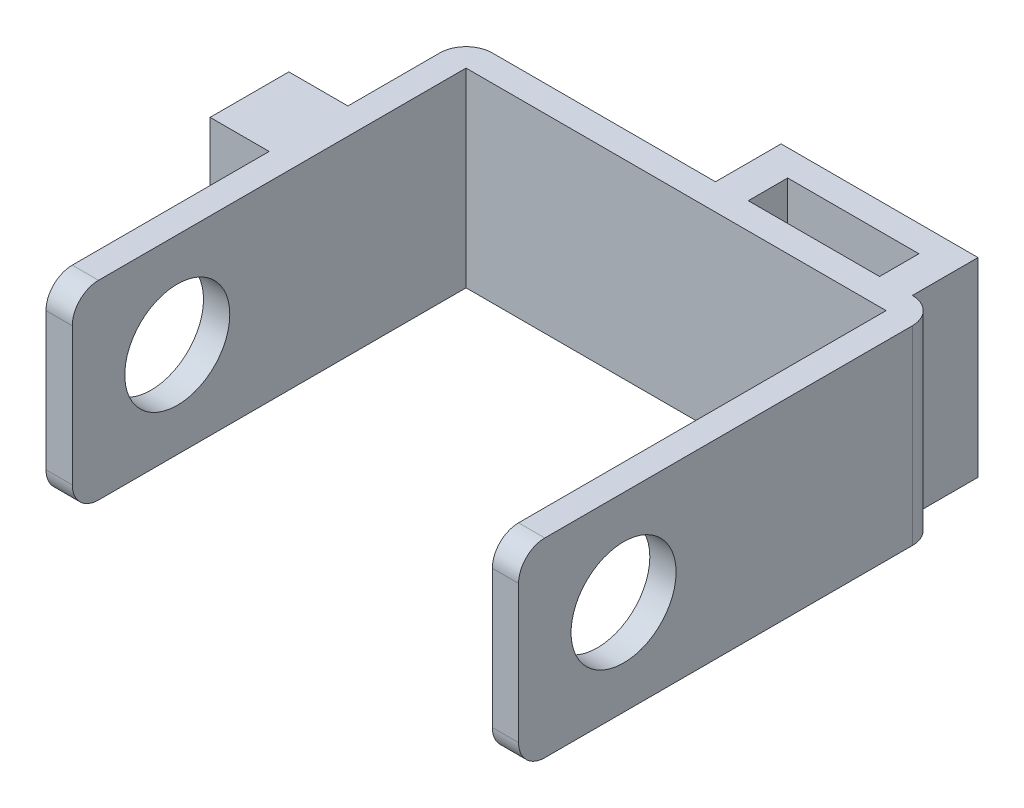
ISO-10303-21;
HEADER;
FILE_DESCRIPTION(('STEP AP214'),'2;1');
FILE_NAME('part.step','',(''),(''),'','','');
FILE_SCHEMA(('AUTOMOTIVE_DESIGN { 1 0 10303 214 1 1 1 1 }'));
ENDSEC;
DATA;
#1=APPLICATION_CONTEXT('core data for automotive mechanical design processes');
#2=APPLICATION_PROTOCOL_DEFINITION('international standard','automotive_design',2000,#1);
#3=PRODUCT_CONTEXT('',#1,'mechanical');
#4=PRODUCT('Part','Part','',(#3));
#5=PRODUCT_RELATED_PRODUCT_CATEGORY('part','',(#4));
#6=PRODUCT_DEFINITION_FORMATION('','',#4);
#7=PRODUCT_DEFINITION_CONTEXT('part definition',#1,'design');
#8=PRODUCT_DEFINITION('design','',#6,#7);
#9=PRODUCT_DEFINITION_SHAPE('','',#8);
#10=(LENGTH_UNIT() NAMED_UNIT(*) SI_UNIT(.MILLI.,.METRE.));
#11=(NAMED_UNIT(*) PLANE_ANGLE_UNIT() SI_UNIT($,.RADIAN.));
#12=(NAMED_UNIT(*) SI_UNIT($,.STERADIAN.) SOLID_ANGLE_UNIT());
#13=UNCERTAINTY_MEASURE_WITH_UNIT(LENGTH_MEASURE(1.E-05),#10,'distance_accuracy_value','');
#14=(GEOMETRIC_REPRESENTATION_CONTEXT(3) GLOBAL_UNCERTAINTY_ASSIGNED_CONTEXT((#13)) GLOBAL_UNIT_ASSIGNED_CONTEXT((#10,
#11,#12)) REPRESENTATION_CONTEXT('',''));
#15=CARTESIAN_POINT('',(0.,0.,0.));
#16=DIRECTION('',(0.,0.,1.));
#17=DIRECTION('',(1.,0.,0.));
#18=AXIS2_PLACEMENT_3D('',#15,#16,#17);
#19=CARTESIAN_POINT('',(-2.,14.5,0.));
#20=DIRECTION('',(-1.,0.,0.));
#21=DIRECTION('',(0.,0.,1.));
#22=AXIS2_PLACEMENT_3D('',#19,#20,#21);
#23=PLANE('',#22);
#24=CARTESIAN_POINT('',(-2.,7.25,-8.));
#25=DIRECTION('',(-1.,0.,0.));
#26=DIRECTION('',(0.,0.,1.));
#27=AXIS2_PLACEMENT_3D('',#24,#25,#26);
#28=CIRCLE('',#27,4.);
#29=CARTESIAN_POINT('',(-2.,7.25,-12.));
#30=VERTEX_POINT('',#29);
#31=EDGE_CURVE('E282',#30,#30,#28,.T.);
#32=ORIENTED_EDGE('',*,*,#31,.F.);
#33=EDGE_LOOP('',(#32));
#34=FACE_BOUND('',#33,.T.);
#35=DIRECTION('',(0.,0.,-1.));
#36=VECTOR('',#35,1.);
#37=CARTESIAN_POINT('',(-2.,14.5,0.));
#38=LINE('',#37,#36);
#39=CARTESIAN_POINT('',(-2.,14.5,-2.));
#40=VERTEX_POINT('',#39);
#41=CARTESIAN_POINT('',(-2.,14.5,-17.));
#42=VERTEX_POINT('',#41);
#43=EDGE_CURVE('E322',#40,#42,#38,.T.);
#44=ORIENTED_EDGE('',*,*,#43,.T.);
#45=DIRECTION('',(0.,1.,0.));
#46=VECTOR('',#45,1.);
#47=CARTESIAN_POINT('',(-2.,14.5,-17.));
#48=LINE('',#47,#46);
#49=CARTESIAN_POINT('',(-2.,10.25,-17.));
#50=VERTEX_POINT('',#49);
#51=EDGE_CURVE('E268',#50,#42,#48,.T.);
#52=ORIENTED_EDGE('',*,*,#51,.F.);
#53=DIRECTION('',(0.,0.,1.));
#54=VECTOR('',#53,1.);
#55=CARTESIAN_POINT('',(-2.,10.25,-37.));
#56=LINE('',#55,#54);
#57=CARTESIAN_POINT('',(-2.,10.25,-23.));
#58=VERTEX_POINT('',#57);
#59=EDGE_CURVE('E245',#58,#50,#56,.T.);
#60=ORIENTED_EDGE('',*,*,#59,.F.);
#61=DIRECTION('',(0.,-1.,0.));
#62=VECTOR('',#61,1.);
#63=CARTESIAN_POINT('',(-2.,14.5,-23.));
#64=LINE('',#63,#62);
#65=CARTESIAN_POINT('',(-2.,14.5,-23.));
#66=VERTEX_POINT('',#65);
#67=EDGE_CURVE('E265',#66,#58,#64,.T.);
#68=ORIENTED_EDGE('',*,*,#67,.F.);
#69=CARTESIAN_POINT('',(-2.,14.5,-30.));
#70=VERTEX_POINT('',#69);
#71=EDGE_CURVE('E326',#66,#70,#38,.T.);
#72=ORIENTED_EDGE('',*,*,#71,.T.);
#73=DIRECTION('',(0.,-1.,0.));
#74=VECTOR('',#73,1.);
#75=CARTESIAN_POINT('',(-2.,14.5,-30.));
#76=LINE('',#75,#74);
#77=CARTESIAN_POINT('',(-2.,0.,-30.));
#78=VERTEX_POINT('',#77);
#79=EDGE_CURVE('E406',#70,#78,#76,.T.);
#80=ORIENTED_EDGE('',*,*,#79,.T.);
#81=DIRECTION('',(0.,0.,-1.));
#82=VECTOR('',#81,1.);
#83=CARTESIAN_POINT('',(-2.,0.,0.));
#84=LINE('',#83,#82);
#85=CARTESIAN_POINT('',(-2.,0.,-23.));
#86=VERTEX_POINT('',#85);
#87=EDGE_CURVE('E315',#86,#78,#84,.T.);
#88=ORIENTED_EDGE('',*,*,#87,.F.);
#89=CARTESIAN_POINT('',(-2.,4.25,-23.));
#90=VERTEX_POINT('',#89);
#91=EDGE_CURVE('E254',#90,#86,#64,.T.);
#92=ORIENTED_EDGE('',*,*,#91,.F.);
#93=DIRECTION('',(0.,0.,1.));
#94=VECTOR('',#93,1.);
#95=CARTESIAN_POINT('',(-2.,4.25,-37.));
#96=LINE('',#95,#94);
#97=CARTESIAN_POINT('',(-2.,4.25,-17.));
#98=VERTEX_POINT('',#97);
#99=EDGE_CURVE('E230',#90,#98,#96,.T.);
#100=ORIENTED_EDGE('',*,*,#99,.T.);
#101=CARTESIAN_POINT('',(-2.,0.,-17.));
#102=VERTEX_POINT('',#101);
#103=EDGE_CURVE('E240',#102,#98,#48,.T.);
#104=ORIENTED_EDGE('',*,*,#103,.F.);
#105=CARTESIAN_POINT('',(-2.,0.,-2.));
#106=VERTEX_POINT('',#105);
#107=EDGE_CURVE('E347',#106,#102,#84,.T.);
#108=ORIENTED_EDGE('',*,*,#107,.F.);
#109=CARTESIAN_POINT('',(-2.,2.,-2.));
#110=DIRECTION('',(-1.,0.,0.));
#111=DIRECTION('',(0.,0.,1.));
#112=AXIS2_PLACEMENT_3D('',#109,#110,#111);
#113=CIRCLE('',#112,2.);
#114=CARTESIAN_POINT('',(-2.,2.,0.));
#115=VERTEX_POINT('',#114);
#116=EDGE_CURVE('E445',#106,#115,#113,.T.);
#117=ORIENTED_EDGE('',*,*,#116,.T.);
#118=DIRECTION('',(0.,-1.,0.));
#119=VECTOR('',#118,1.);
#120=CARTESIAN_POINT('',(-2.,14.5,0.));
#121=LINE('',#120,#119);
#122=CARTESIAN_POINT('',(-2.,12.5,0.));
#123=VERTEX_POINT('',#122);
#124=EDGE_CURVE('E346',#123,#115,#121,.T.);
#125=ORIENTED_EDGE('',*,*,#124,.F.);
#126=CARTESIAN_POINT('',(-2.,12.5,-2.));
#127=DIRECTION('',(-1.,0.,0.));
#128=DIRECTION('',(0.,0.,1.));
#129=AXIS2_PLACEMENT_3D('',#126,#127,#128);
#130=CIRCLE('',#129,2.);
#131=EDGE_CURVE('E418',#123,#40,#130,.T.);
#132=ORIENTED_EDGE('',*,*,#131,.T.);
#133=EDGE_LOOP('',(#44,#52,#60,#68,#72,#80,#88,#92,#100,#104,#108,#117,#125,#132));
#134=FACE_BOUND('',#133,.T.);
#135=ADVANCED_FACE('F33',(#34,#134),#23,.T.);
#136=CARTESIAN_POINT('',(0.,14.5,0.));
#137=DIRECTION('',(0.,0.,1.));
#138=DIRECTION('',(1.,0.,0.));
#139=AXIS2_PLACEMENT_3D('',#136,#137,#138);
#140=PLANE('',#139);
#141=ORIENTED_EDGE('',*,*,#124,.T.);
#142=DIRECTION('',(-1.,0.,0.));
#143=VECTOR('',#142,1.);
#144=CARTESIAN_POINT('',(0.,2.,0.));
#145=LINE('',#144,#143);
#146=CARTESIAN_POINT('',(0.,2.,0.));
#147=VERTEX_POINT('',#146);
#148=EDGE_CURVE('E41',#115,#147,#145,.F.);
#149=ORIENTED_EDGE('',*,*,#148,.T.);
#150=DIRECTION('',(0.,-1.,0.));
#151=VECTOR('',#150,1.);
#152=CARTESIAN_POINT('',(0.,14.5,0.));
#153=LINE('',#152,#151);
#154=CARTESIAN_POINT('',(0.,12.5,0.));
#155=VERTEX_POINT('',#154);
#156=EDGE_CURVE('E371',#155,#147,#153,.T.);
#157=ORIENTED_EDGE('',*,*,#156,.F.);
#158=DIRECTION('',(-1.,0.,0.));
#159=VECTOR('',#158,1.);
#160=CARTESIAN_POINT('',(-2.,12.5,0.));
#161=LINE('',#160,#159);
#162=EDGE_CURVE('E415',#155,#123,#161,.T.);
#163=ORIENTED_EDGE('',*,*,#162,.T.);
#164=EDGE_LOOP('',(#141,#149,#157,#163));
#165=FACE_BOUND('',#164,.T.);
#166=ADVANCED_FACE('F449',(#165),#140,.T.);
#167=CARTESIAN_POINT('',(0.,14.5,0.));
#168=DIRECTION('',(-1.,0.,0.));
#169=DIRECTION('',(0.,0.,1.));
#170=AXIS2_PLACEMENT_3D('',#167,#168,#169);
#171=PLANE('',#170);
#172=CARTESIAN_POINT('',(0.,7.25,-8.));
#173=DIRECTION('',(-1.,0.,0.));
#174=DIRECTION('',(0.,0.,1.));
#175=AXIS2_PLACEMENT_3D('',#172,#173,#174);
#176=CIRCLE('',#175,4.);
#177=CARTESIAN_POINT('',(0.,7.25,-12.));
#178=VERTEX_POINT('',#177);
#179=EDGE_CURVE('E286',#178,#178,#176,.T.);
#180=ORIENTED_EDGE('',*,*,#179,.T.);
#181=EDGE_LOOP('',(#180));
#182=FACE_BOUND('',#181,.T.);
#183=ORIENTED_EDGE('',*,*,#156,.T.);
#184=CARTESIAN_POINT('',(0.,2.,-2.));
#185=DIRECTION('',(-1.,0.,0.));
#186=DIRECTION('',(0.,0.,1.));
#187=AXIS2_PLACEMENT_3D('',#184,#185,#186);
#188=CIRCLE('',#187,2.);
#189=CARTESIAN_POINT('',(0.,0.,-2.));
#190=VERTEX_POINT('',#189);
#191=EDGE_CURVE('E11',#147,#190,#188,.F.);
#192=ORIENTED_EDGE('',*,*,#191,.T.);
#193=DIRECTION('',(0.,0.,-1.));
#194=VECTOR('',#193,1.);
#195=CARTESIAN_POINT('',(0.,0.,0.));
#196=LINE('',#195,#194);
#197=CARTESIAN_POINT('',(0.,0.,-30.));
#198=VERTEX_POINT('',#197);
#199=EDGE_CURVE('E369',#190,#198,#196,.T.);
#200=ORIENTED_EDGE('',*,*,#199,.T.);
#201=DIRECTION('',(0.,-1.,0.));
#202=VECTOR('',#201,1.);
#203=CARTESIAN_POINT('',(0.,14.5,-30.));
#204=LINE('',#203,#202);
#205=CARTESIAN_POINT('',(0.,14.5,-30.));
#206=VERTEX_POINT('',#205);
#207=EDGE_CURVE('E375',#206,#198,#204,.T.);
#208=ORIENTED_EDGE('',*,*,#207,.F.);
#209=DIRECTION('',(0.,0.,-1.));
#210=VECTOR('',#209,1.);
#211=CARTESIAN_POINT('',(0.,14.5,0.));
#212=LINE('',#211,#210);
#213=CARTESIAN_POINT('',(0.,14.5,-2.));
#214=VERTEX_POINT('',#213);
#215=EDGE_CURVE('E344',#214,#206,#212,.T.);
#216=ORIENTED_EDGE('',*,*,#215,.F.);
#217=CARTESIAN_POINT('',(0.,12.5,-2.));
#218=DIRECTION('',(-1.,0.,0.));
#219=DIRECTION('',(0.,0.,1.));
#220=AXIS2_PLACEMENT_3D('',#217,#218,#219);
#221=CIRCLE('',#220,2.);
#222=EDGE_CURVE('E422',#214,#155,#221,.F.);
#223=ORIENTED_EDGE('',*,*,#222,.T.);
#224=EDGE_LOOP('',(#183,#192,#200,#208,#216,#223));
#225=FACE_BOUND('',#224,.T.);
#226=ADVANCED_FACE('F455',(#182,#225),#171,.F.);
#227=CARTESIAN_POINT('',(0.,14.5,-30.));
#228=DIRECTION('',(0.,0.,-1.));
#229=DIRECTION('',(-1.,0.,0.));
#230=AXIS2_PLACEMENT_3D('',#227,#228,#229);
#231=PLANE('',#230);
#232=DIRECTION('',(1.,0.,0.));
#233=VECTOR('',#232,1.);
#234=CARTESIAN_POINT('',(0.,0.,-30.));
#235=LINE('',#234,#233);
#236=CARTESIAN_POINT('',(32.,0.,-30.));
#237=VERTEX_POINT('',#236);
#238=EDGE_CURVE('E366',#198,#237,#235,.T.);
#239=ORIENTED_EDGE('',*,*,#238,.T.);
#240=DIRECTION('',(0.,-1.,0.));
#241=VECTOR('',#240,1.);
#242=CARTESIAN_POINT('',(32.,14.5,-30.));
#243=LINE('',#242,#241);
#244=CARTESIAN_POINT('',(32.,14.5,-30.));
#245=VERTEX_POINT('',#244);
#246=EDGE_CURVE('E378',#245,#237,#243,.T.);
#247=ORIENTED_EDGE('',*,*,#246,.F.);
#248=DIRECTION('',(1.,0.,0.));
#249=VECTOR('',#248,1.);
#250=CARTESIAN_POINT('',(0.,14.5,-30.));
#251=LINE('',#250,#249);
#252=EDGE_CURVE('E341',#206,#245,#251,.T.);
#253=ORIENTED_EDGE('',*,*,#252,.F.);
#254=ORIENTED_EDGE('',*,*,#207,.T.);
#255=EDGE_LOOP('',(#239,#247,#253,#254));
#256=FACE_BOUND('',#255,.T.);
#257=ADVANCED_FACE('F536',(#256),#231,.F.);
#258=CARTESIAN_POINT('',(32.,14.5,0.));
#259=DIRECTION('',(-1.,0.,0.));
#260=DIRECTION('',(0.,0.,1.));
#261=AXIS2_PLACEMENT_3D('',#258,#259,#260);
#262=PLANE('',#261);
#263=CARTESIAN_POINT('',(32.,7.25,-8.));
#264=DIRECTION('',(-1.,0.,0.));
#265=DIRECTION('',(0.,0.,1.));
#266=AXIS2_PLACEMENT_3D('',#263,#264,#265);
#267=CIRCLE('',#266,4.);
#268=CARTESIAN_POINT('',(32.,7.25,-4.));
#269=VERTEX_POINT('',#268);
#270=EDGE_CURVE('E283',#269,#269,#267,.T.);
#271=ORIENTED_EDGE('',*,*,#270,.F.);
#272=EDGE_LOOP('',(#271));
#273=FACE_BOUND('',#272,.T.);
#274=DIRECTION('',(0.,0.,-1.));
#275=VECTOR('',#274,1.);
#276=CARTESIAN_POINT('',(32.,0.,0.));
#277=LINE('',#276,#275);
#278=CARTESIAN_POINT('',(32.,0.,-2.));
#279=VERTEX_POINT('',#278);
#280=EDGE_CURVE('E364',#279,#237,#277,.T.);
#281=ORIENTED_EDGE('',*,*,#280,.F.);
#282=CARTESIAN_POINT('',(32.,2.,-2.));
#283=DIRECTION('',(-1.,0.,0.));
#284=DIRECTION('',(0.,0.,1.));
#285=AXIS2_PLACEMENT_3D('',#282,#283,#284);
#286=CIRCLE('',#285,2.);
#287=CARTESIAN_POINT('',(32.,2.,0.));
#288=VERTEX_POINT('',#287);
#289=EDGE_CURVE('E440',#279,#288,#286,.T.);
#290=ORIENTED_EDGE('',*,*,#289,.T.);
#291=DIRECTION('',(0.,-1.,0.));
#292=VECTOR('',#291,1.);
#293=CARTESIAN_POINT('',(32.,14.5,0.));
#294=LINE('',#293,#292);
#295=CARTESIAN_POINT('',(32.,12.5,0.));
#296=VERTEX_POINT('',#295);
#297=EDGE_CURVE('E381',#296,#288,#294,.T.);
#298=ORIENTED_EDGE('',*,*,#297,.F.);
#299=CARTESIAN_POINT('',(32.,12.5,-2.));
#300=DIRECTION('',(-1.,0.,0.));
#301=DIRECTION('',(0.,0.,1.));
#302=AXIS2_PLACEMENT_3D('',#299,#300,#301);
#303=CIRCLE('',#302,2.);
#304=CARTESIAN_POINT('',(32.,14.5,-2.));
#305=VERTEX_POINT('',#304);
#306=EDGE_CURVE('E431',#296,#305,#303,.T.);
#307=ORIENTED_EDGE('',*,*,#306,.T.);
#308=DIRECTION('',(0.,0.,-1.));
#309=VECTOR('',#308,1.);
#310=CARTESIAN_POINT('',(32.,14.5,0.));
#311=LINE('',#310,#309);
#312=EDGE_CURVE('E339',#305,#245,#311,.T.);
#313=ORIENTED_EDGE('',*,*,#312,.T.);
#314=ORIENTED_EDGE('',*,*,#246,.T.);
#315=EDGE_LOOP('',(#281,#290,#298,#307,#313,#314));
#316=FACE_BOUND('',#315,.T.);
#317=ADVANCED_FACE('F529',(#273,#316),#262,.T.);
#318=CARTESIAN_POINT('',(32.,14.5,0.));
#319=DIRECTION('',(0.,0.,-1.));
#320=DIRECTION('',(-1.,0.,0.));
#321=AXIS2_PLACEMENT_3D('',#318,#319,#320);
#322=PLANE('',#321);
#323=ORIENTED_EDGE('',*,*,#297,.T.);
#324=DIRECTION('',(1.,0.,0.));
#325=VECTOR('',#324,1.);
#326=CARTESIAN_POINT('',(34.,2.,0.));
#327=LINE('',#326,#325);
#328=CARTESIAN_POINT('',(34.,2.,0.));
#329=VERTEX_POINT('',#328);
#330=EDGE_CURVE('E433',#288,#329,#327,.T.);
#331=ORIENTED_EDGE('',*,*,#330,.T.);
#332=DIRECTION('',(0.,-1.,0.));
#333=VECTOR('',#332,1.);
#334=CARTESIAN_POINT('',(34.,14.5,0.));
#335=LINE('',#334,#333);
#336=CARTESIAN_POINT('',(34.,12.5,0.));
#337=VERTEX_POINT('',#336);
#338=EDGE_CURVE('E384',#337,#329,#335,.T.);
#339=ORIENTED_EDGE('',*,*,#338,.F.);
#340=DIRECTION('',(1.,0.,0.));
#341=VECTOR('',#340,1.);
#342=CARTESIAN_POINT('',(32.,12.5,0.));
#343=LINE('',#342,#341);
#344=EDGE_CURVE('E429',#337,#296,#343,.F.);
#345=ORIENTED_EDGE('',*,*,#344,.T.);
#346=EDGE_LOOP('',(#323,#331,#339,#345));
#347=FACE_BOUND('',#346,.T.);
#348=ADVANCED_FACE('F523',(#347),#322,.F.);
#349=CARTESIAN_POINT('',(34.,14.5,-32.));
#350=DIRECTION('',(1.,0.,0.));
#351=DIRECTION('',(0.,0.,-1.));
#352=AXIS2_PLACEMENT_3D('',#349,#350,#351);
#353=PLANE('',#352);
#354=CARTESIAN_POINT('',(34.,7.25,-8.));
#355=DIRECTION('',(1.,0.,0.));
#356=DIRECTION('',(0.,0.,-1.));
#357=AXIS2_PLACEMENT_3D('',#354,#355,#356);
#358=CIRCLE('',#357,4.);
#359=CARTESIAN_POINT('',(34.,7.25,-12.));
#360=VERTEX_POINT('',#359);
#361=EDGE_CURVE('E279',#360,#360,#358,.T.);
#362=ORIENTED_EDGE('',*,*,#361,.F.);
#363=EDGE_LOOP('',(#362));
#364=FACE_BOUND('',#363,.T.);
#365=ORIENTED_EDGE('',*,*,#338,.T.);
#366=CARTESIAN_POINT('',(34.,2.,-2.));
#367=DIRECTION('',(1.,0.,0.));
#368=DIRECTION('',(0.,0.,-1.));
#369=AXIS2_PLACEMENT_3D('',#366,#367,#368);
#370=CIRCLE('',#369,2.);
#371=CARTESIAN_POINT('',(34.,0.,-2.));
#372=VERTEX_POINT('',#371);
#373=EDGE_CURVE('E436',#329,#372,#370,.T.);
#374=ORIENTED_EDGE('',*,*,#373,.T.);
#375=DIRECTION('',(0.,0.,1.));
#376=VECTOR('',#375,1.);
#377=CARTESIAN_POINT('',(34.,0.,-32.));
#378=LINE('',#377,#376);
#379=CARTESIAN_POINT('',(34.,0.,-30.));
#380=VERTEX_POINT('',#379);
#381=EDGE_CURVE('E361',#380,#372,#378,.T.);
#382=ORIENTED_EDGE('',*,*,#381,.F.);
#383=DIRECTION('',(0.,-1.,0.));
#384=VECTOR('',#383,1.);
#385=CARTESIAN_POINT('',(34.,14.5,-30.));
#386=LINE('',#385,#384);
#387=CARTESIAN_POINT('',(34.,14.5,-30.));
#388=VERTEX_POINT('',#387);
#389=EDGE_CURVE('E402',#380,#388,#386,.F.);
#390=ORIENTED_EDGE('',*,*,#389,.T.);
#391=DIRECTION('',(0.,0.,1.));
#392=VECTOR('',#391,1.);
#393=CARTESIAN_POINT('',(34.,14.5,-32.));
#394=LINE('',#393,#392);
#395=CARTESIAN_POINT('',(34.,14.5,-2.));
#396=VERTEX_POINT('',#395);
#397=EDGE_CURVE('E336',#388,#396,#394,.T.);
#398=ORIENTED_EDGE('',*,*,#397,.T.);
#399=CARTESIAN_POINT('',(34.,12.5,-2.));
#400=DIRECTION('',(1.,0.,0.));
#401=DIRECTION('',(0.,0.,-1.));
#402=AXIS2_PLACEMENT_3D('',#399,#400,#401);
#403=CIRCLE('',#402,2.);
#404=EDGE_CURVE('E427',#396,#337,#403,.T.);
#405=ORIENTED_EDGE('',*,*,#404,.T.);
#406=EDGE_LOOP('',(#365,#374,#382,#390,#398,#405));
#407=FACE_BOUND('',#406,.T.);
#408=ADVANCED_FACE('F515',(#364,#407),#353,.T.);
#409=CARTESIAN_POINT('',(32.,14.5,-32.));
#410=DIRECTION('',(-1.,0.,0.));
#411=DIRECTION('',(0.,0.,1.));
#412=AXIS2_PLACEMENT_3D('',#409,#410,#411);
#413=PLANE('',#412);
#414=DIRECTION('',(0.,0.,-1.));
#415=VECTOR('',#414,1.);
#416=CARTESIAN_POINT('',(32.,0.,-32.));
#417=LINE('',#416,#415);
#418=CARTESIAN_POINT('',(32.,0.,-32.));
#419=VERTEX_POINT('',#418);
#420=CARTESIAN_POINT('',(32.,0.,-37.));
#421=VERTEX_POINT('',#420);
#422=EDGE_CURVE('E358',#419,#421,#417,.T.);
#423=ORIENTED_EDGE('',*,*,#422,.T.);
#424=DIRECTION('',(0.,-1.,0.));
#425=VECTOR('',#424,1.);
#426=CARTESIAN_POINT('',(32.,14.5,-37.));
#427=LINE('',#426,#425);
#428=CARTESIAN_POINT('',(32.,14.5,-37.));
#429=VERTEX_POINT('',#428);
#430=EDGE_CURVE('E390',#429,#421,#427,.T.);
#431=ORIENTED_EDGE('',*,*,#430,.F.);
#432=DIRECTION('',(0.,0.,-1.));
#433=VECTOR('',#432,1.);
#434=CARTESIAN_POINT('',(32.,14.5,-32.));
#435=LINE('',#434,#433);
#436=CARTESIAN_POINT('',(32.,14.5,-32.));
#437=VERTEX_POINT('',#436);
#438=EDGE_CURVE('E334',#437,#429,#435,.T.);
#439=ORIENTED_EDGE('',*,*,#438,.F.);
#440=DIRECTION('',(0.,-1.,0.));
#441=VECTOR('',#440,1.);
#442=CARTESIAN_POINT('',(32.,14.5,-32.));
#443=LINE('',#442,#441);
#444=EDGE_CURVE('E387',#437,#419,#443,.T.);
#445=ORIENTED_EDGE('',*,*,#444,.T.);
#446=EDGE_LOOP('',(#423,#431,#439,#445));
#447=FACE_BOUND('',#446,.T.);
#448=ADVANCED_FACE('F506',(#447),#413,.F.);
#449=CARTESIAN_POINT('',(17.,14.5,-37.));
#450=DIRECTION('',(0.,0.,-1.));
#451=DIRECTION('',(-1.,0.,0.));
#452=AXIS2_PLACEMENT_3D('',#449,#450,#451);
#453=PLANE('',#452);
#454=DIRECTION('',(1.,0.,0.));
#455=VECTOR('',#454,1.);
#456=CARTESIAN_POINT('',(17.,0.,-37.));
#457=LINE('',#456,#455);
#458=CARTESIAN_POINT('',(17.,0.,-37.));
#459=VERTEX_POINT('',#458);
#460=EDGE_CURVE('E355',#459,#421,#457,.T.);
#461=ORIENTED_EDGE('',*,*,#460,.F.);
#462=DIRECTION('',(0.,-1.,0.));
#463=VECTOR('',#462,1.);
#464=CARTESIAN_POINT('',(17.,14.5,-37.));
#465=LINE('',#464,#463);
#466=CARTESIAN_POINT('',(17.,14.5,-37.));
#467=VERTEX_POINT('',#466);
#468=EDGE_CURVE('E392',#467,#459,#465,.T.);
#469=ORIENTED_EDGE('',*,*,#468,.F.);
#470=DIRECTION('',(1.,0.,0.));
#471=VECTOR('',#470,1.);
#472=CARTESIAN_POINT('',(17.,14.5,-37.));
#473=LINE('',#472,#471);
#474=EDGE_CURVE('E331',#467,#429,#473,.T.);
#475=ORIENTED_EDGE('',*,*,#474,.T.);
#476=ORIENTED_EDGE('',*,*,#430,.T.);
#477=EDGE_LOOP('',(#461,#469,#475,#476));
#478=FACE_BOUND('',#477,.T.);
#479=ADVANCED_FACE('F502',(#478),#453,.T.);
#480=CARTESIAN_POINT('',(17.,14.5,-32.));
#481=DIRECTION('',(-1.,0.,0.));
#482=DIRECTION('',(0.,0.,1.));
#483=AXIS2_PLACEMENT_3D('',#480,#481,#482);
#484=PLANE('',#483);
#485=DIRECTION('',(0.,0.,-1.));
#486=VECTOR('',#485,1.);
#487=CARTESIAN_POINT('',(17.,0.,-32.));
#488=LINE('',#487,#486);
#489=CARTESIAN_POINT('',(17.,0.,-32.));
#490=VERTEX_POINT('',#489);
#491=EDGE_CURVE('E352',#490,#459,#488,.T.);
#492=ORIENTED_EDGE('',*,*,#491,.F.);
#493=DIRECTION('',(0.,-1.,0.));
#494=VECTOR('',#493,1.);
#495=CARTESIAN_POINT('',(17.,14.5,-32.));
#496=LINE('',#495,#494);
#497=CARTESIAN_POINT('',(17.,14.5,-32.));
#498=VERTEX_POINT('',#497);
#499=EDGE_CURVE('E394',#498,#490,#496,.T.);
#500=ORIENTED_EDGE('',*,*,#499,.F.);
#501=DIRECTION('',(0.,0.,-1.));
#502=VECTOR('',#501,1.);
#503=CARTESIAN_POINT('',(17.,14.5,-32.));
#504=LINE('',#503,#502);
#505=EDGE_CURVE('E328',#498,#467,#504,.T.);
#506=ORIENTED_EDGE('',*,*,#505,.T.);
#507=ORIENTED_EDGE('',*,*,#468,.T.);
#508=EDGE_LOOP('',(#492,#500,#506,#507));
#509=FACE_BOUND('',#508,.T.);
#510=ADVANCED_FACE('F498',(#509),#484,.T.);
#511=CARTESIAN_POINT('',(-2.,14.5,-32.));
#512=DIRECTION('',(0.,0.,-1.));
#513=DIRECTION('',(-1.,0.,0.));
#514=AXIS2_PLACEMENT_3D('',#511,#512,#513);
#515=PLANE('',#514);
#516=DIRECTION('',(1.,0.,0.));
#517=VECTOR('',#516,1.);
#518=CARTESIAN_POINT('',(-2.,0.,-32.));
#519=LINE('',#518,#517);
#520=CARTESIAN_POINT('',(0.,0.,-32.));
#521=VERTEX_POINT('',#520);
#522=EDGE_CURVE('E350',#521,#490,#519,.T.);
#523=ORIENTED_EDGE('',*,*,#522,.F.);
#524=DIRECTION('',(0.,-1.,0.));
#525=VECTOR('',#524,1.);
#526=CARTESIAN_POINT('',(0.,14.5,-32.));
#527=LINE('',#526,#525);
#528=CARTESIAN_POINT('',(0.,14.5,-32.));
#529=VERTEX_POINT('',#528);
#530=EDGE_CURVE('E410',#521,#529,#527,.F.);
#531=ORIENTED_EDGE('',*,*,#530,.T.);
#532=DIRECTION('',(1.,0.,0.));
#533=VECTOR('',#532,1.);
#534=CARTESIAN_POINT('',(-2.,14.5,-32.));
#535=LINE('',#534,#533);
#536=EDGE_CURVE('E325',#529,#498,#535,.T.);
#537=ORIENTED_EDGE('',*,*,#536,.T.);
#538=ORIENTED_EDGE('',*,*,#499,.T.);
#539=EDGE_LOOP('',(#523,#531,#537,#538));
#540=FACE_BOUND('',#539,.T.);
#541=ADVANCED_FACE('F492',(#540),#515,.T.);
#542=CARTESIAN_POINT('',(0.,14.5,0.));
#543=DIRECTION('',(0.,-1.,0.));
#544=DIRECTION('',(0.,0.,-1.));
#545=AXIS2_PLACEMENT_3D('',#542,#543,#544);
#546=PLANE('',#545);
#547=DIRECTION('',(1.,0.,0.));
#548=VECTOR('',#547,1.);
#549=CARTESIAN_POINT('',(19.5,14.5,-32.));
#550=LINE('',#549,#548);
#551=CARTESIAN_POINT('',(19.5,14.5,-32.));
#552=VERTEX_POINT('',#551);
#553=CARTESIAN_POINT('',(29.5,14.5,-32.));
#554=VERTEX_POINT('',#553);
#555=EDGE_CURVE('E305',#552,#554,#550,.T.);
#556=ORIENTED_EDGE('',*,*,#555,.F.);
#557=DIRECTION('',(0.,0.,1.));
#558=VECTOR('',#557,1.);
#559=CARTESIAN_POINT('',(19.5,14.5,-32.));
#560=LINE('',#559,#558);
#561=CARTESIAN_POINT('',(19.5,14.5,-35.));
#562=VERTEX_POINT('',#561);
#563=EDGE_CURVE('E289',#562,#552,#560,.T.);
#564=ORIENTED_EDGE('',*,*,#563,.F.);
#565=DIRECTION('',(-1.,0.,0.));
#566=VECTOR('',#565,1.);
#567=CARTESIAN_POINT('',(19.5,14.5,-35.));
#568=LINE('',#567,#566);
#569=CARTESIAN_POINT('',(29.5,14.5,-35.));
#570=VERTEX_POINT('',#569);
#571=EDGE_CURVE('E294',#570,#562,#568,.T.);
#572=ORIENTED_EDGE('',*,*,#571,.F.);
#573=DIRECTION('',(0.,0.,-1.));
#574=VECTOR('',#573,1.);
#575=CARTESIAN_POINT('',(29.5,14.5,-32.));
#576=LINE('',#575,#574);
#577=EDGE_CURVE('E308',#554,#570,#576,.T.);
#578=ORIENTED_EDGE('',*,*,#577,.F.);
#579=EDGE_LOOP('',(#556,#564,#572,#578));
#580=FACE_BOUND('',#579,.T.);
#581=ORIENTED_EDGE('',*,*,#312,.F.);
#582=DIRECTION('',(1.,0.,0.));
#583=VECTOR('',#582,1.);
#584=CARTESIAN_POINT('',(0.,14.5,-2.));
#585=LINE('',#584,#583);
#586=EDGE_CURVE('E424',#305,#396,#585,.T.);
#587=ORIENTED_EDGE('',*,*,#586,.T.);
#588=ORIENTED_EDGE('',*,*,#397,.F.);
#589=CARTESIAN_POINT('',(32.,14.5,-30.));
#590=DIRECTION('',(0.,-1.,0.));
#591=DIRECTION('',(0.,0.,-1.));
#592=AXIS2_PLACEMENT_3D('',#589,#590,#591);
#593=CIRCLE('',#592,2.);
#594=EDGE_CURVE('E404',#388,#437,#593,.F.);
#595=ORIENTED_EDGE('',*,*,#594,.T.);
#596=ORIENTED_EDGE('',*,*,#438,.T.);
#597=ORIENTED_EDGE('',*,*,#474,.F.);
#598=ORIENTED_EDGE('',*,*,#505,.F.);
#599=ORIENTED_EDGE('',*,*,#536,.F.);
#600=CARTESIAN_POINT('',(0.,14.5,-30.));
#601=DIRECTION('',(0.,-1.,0.));
#602=DIRECTION('',(0.,0.,-1.));
#603=AXIS2_PLACEMENT_3D('',#600,#601,#602);
#604=CIRCLE('',#603,2.);
#605=EDGE_CURVE('E412',#529,#70,#604,.F.);
#606=ORIENTED_EDGE('',*,*,#605,.T.);
#607=ORIENTED_EDGE('',*,*,#71,.F.);
#608=DIRECTION('',(1.,0.,0.));
#609=VECTOR('',#608,1.);
#610=CARTESIAN_POINT('',(-6.5,14.5,-23.));
#611=LINE('',#610,#609);
#612=CARTESIAN_POINT('',(-6.5,14.5,-23.));
#613=VERTEX_POINT('',#612);
#614=EDGE_CURVE('E277',#613,#66,#611,.T.);
#615=ORIENTED_EDGE('',*,*,#614,.F.);
#616=DIRECTION('',(0.,0.,-1.));
#617=VECTOR('',#616,1.);
#618=CARTESIAN_POINT('',(-6.5,14.5,-17.));
#619=LINE('',#618,#617);
#620=CARTESIAN_POINT('',(-6.5,14.5,-17.));
#621=VERTEX_POINT('',#620);
#622=EDGE_CURVE('E255',#621,#613,#619,.T.);
#623=ORIENTED_EDGE('',*,*,#622,.F.);
#624=DIRECTION('',(1.,0.,0.));
#625=VECTOR('',#624,1.);
#626=CARTESIAN_POINT('',(-6.5,14.5,-17.));
#627=LINE('',#626,#625);
#628=EDGE_CURVE('E264',#621,#42,#627,.T.);
#629=ORIENTED_EDGE('',*,*,#628,.T.);
#630=ORIENTED_EDGE('',*,*,#43,.F.);
#631=DIRECTION('',(-1.,0.,0.));
#632=VECTOR('',#631,1.);
#633=CARTESIAN_POINT('',(0.,14.5,-2.));
#634=LINE('',#633,#632);
#635=EDGE_CURVE('E420',#40,#214,#634,.F.);
#636=ORIENTED_EDGE('',*,*,#635,.T.);
#637=ORIENTED_EDGE('',*,*,#215,.T.);
#638=ORIENTED_EDGE('',*,*,#252,.T.);
#639=EDGE_LOOP('',(#581,#587,#588,#595,#596,#597,#598,#599,#606,#607,#615,#623,#629,#630,#636,
#637,#638));
#640=FACE_BOUND('',#639,.T.);
#641=ADVANCED_FACE('F480',(#580,#640),#546,.F.);
#642=CARTESIAN_POINT('',(0.,0.,0.));
#643=DIRECTION('',(0.,-1.,0.));
#644=DIRECTION('',(0.,0.,-1.));
#645=AXIS2_PLACEMENT_3D('',#642,#643,#644);
#646=PLANE('',#645);
#647=DIRECTION('',(0.,0.,1.));
#648=VECTOR('',#647,1.);
#649=CARTESIAN_POINT('',(19.5,0.,-32.));
#650=LINE('',#649,#648);
#651=CARTESIAN_POINT('',(19.5,0.,-35.));
#652=VERTEX_POINT('',#651);
#653=CARTESIAN_POINT('',(19.5,0.,-32.));
#654=VERTEX_POINT('',#653);
#655=EDGE_CURVE('E290',#652,#654,#650,.T.);
#656=ORIENTED_EDGE('',*,*,#655,.T.);
#657=DIRECTION('',(1.,0.,0.));
#658=VECTOR('',#657,1.);
#659=CARTESIAN_POINT('',(19.5,0.,-32.));
#660=LINE('',#659,#658);
#661=CARTESIAN_POINT('',(29.5,0.,-32.));
#662=VERTEX_POINT('',#661);
#663=EDGE_CURVE('E293',#654,#662,#660,.T.);
#664=ORIENTED_EDGE('',*,*,#663,.T.);
#665=DIRECTION('',(0.,0.,-1.));
#666=VECTOR('',#665,1.);
#667=CARTESIAN_POINT('',(29.5,0.,-32.));
#668=LINE('',#667,#666);
#669=CARTESIAN_POINT('',(29.5,0.,-35.));
#670=VERTEX_POINT('',#669);
#671=EDGE_CURVE('E297',#662,#670,#668,.T.);
#672=ORIENTED_EDGE('',*,*,#671,.T.);
#673=DIRECTION('',(-1.,0.,0.));
#674=VECTOR('',#673,1.);
#675=CARTESIAN_POINT('',(19.5,0.,-35.));
#676=LINE('',#675,#674);
#677=EDGE_CURVE('E300',#670,#652,#676,.T.);
#678=ORIENTED_EDGE('',*,*,#677,.T.);
#679=EDGE_LOOP('',(#656,#664,#672,#678));
#680=FACE_BOUND('',#679,.T.);
#681=ORIENTED_EDGE('',*,*,#199,.F.);
#682=DIRECTION('',(-1.,0.,0.));
#683=VECTOR('',#682,1.);
#684=CARTESIAN_POINT('',(0.,0.,-2.));
#685=LINE('',#684,#683);
#686=EDGE_CURVE('E442',#190,#106,#685,.T.);
#687=ORIENTED_EDGE('',*,*,#686,.T.);
#688=ORIENTED_EDGE('',*,*,#107,.T.);
#689=DIRECTION('',(1.,0.,0.));
#690=VECTOR('',#689,1.);
#691=CARTESIAN_POINT('',(-6.5,0.,-17.));
#692=LINE('',#691,#690);
#693=CARTESIAN_POINT('',(-6.5,0.,-17.));
#694=VERTEX_POINT('',#693);
#695=EDGE_CURVE('E272',#694,#102,#692,.T.);
#696=ORIENTED_EDGE('',*,*,#695,.F.);
#697=DIRECTION('',(0.,0.,1.));
#698=VECTOR('',#697,1.);
#699=CARTESIAN_POINT('',(-6.5,0.,-17.));
#700=LINE('',#699,#698);
#701=CARTESIAN_POINT('',(-6.5,0.,-23.));
#702=VERTEX_POINT('',#701);
#703=EDGE_CURVE('E260',#702,#694,#700,.T.);
#704=ORIENTED_EDGE('',*,*,#703,.F.);
#705=DIRECTION('',(1.,0.,0.));
#706=VECTOR('',#705,1.);
#707=CARTESIAN_POINT('',(-6.5,0.,-23.));
#708=LINE('',#707,#706);
#709=EDGE_CURVE('E274',#702,#86,#708,.T.);
#710=ORIENTED_EDGE('',*,*,#709,.T.);
#711=ORIENTED_EDGE('',*,*,#87,.T.);
#712=CARTESIAN_POINT('',(0.,0.,-30.));
#713=DIRECTION('',(0.,-1.,0.));
#714=DIRECTION('',(0.,0.,-1.));
#715=AXIS2_PLACEMENT_3D('',#712,#713,#714);
#716=CIRCLE('',#715,2.);
#717=EDGE_CURVE('E408',#78,#521,#716,.T.);
#718=ORIENTED_EDGE('',*,*,#717,.T.);
#719=ORIENTED_EDGE('',*,*,#522,.T.);
#720=ORIENTED_EDGE('',*,*,#491,.T.);
#721=ORIENTED_EDGE('',*,*,#460,.T.);
#722=ORIENTED_EDGE('',*,*,#422,.F.);
#723=CARTESIAN_POINT('',(32.,0.,-30.));
#724=DIRECTION('',(0.,-1.,0.));
#725=DIRECTION('',(0.,0.,-1.));
#726=AXIS2_PLACEMENT_3D('',#723,#724,#725);
#727=CIRCLE('',#726,2.);
#728=EDGE_CURVE('E374',#419,#380,#727,.T.);
#729=ORIENTED_EDGE('',*,*,#728,.T.);
#730=ORIENTED_EDGE('',*,*,#381,.T.);
#731=DIRECTION('',(1.,0.,0.));
#732=VECTOR('',#731,1.);
#733=CARTESIAN_POINT('',(32.,0.,-2.));
#734=LINE('',#733,#732);
#735=EDGE_CURVE('E438',#372,#279,#734,.F.);
#736=ORIENTED_EDGE('',*,*,#735,.T.);
#737=ORIENTED_EDGE('',*,*,#280,.T.);
#738=ORIENTED_EDGE('',*,*,#238,.F.);
#739=EDGE_LOOP('',(#681,#687,#688,#696,#704,#710,#711,#718,#719,#720,#721,#722,#729,#730,#736,
#737,#738));
#740=FACE_BOUND('',#739,.T.);
#741=ADVANCED_FACE('F462',(#680,#740),#646,.T.);
#742=CARTESIAN_POINT('',(19.5,0.,-32.));
#743=DIRECTION('',(-1.,0.,0.));
#744=DIRECTION('',(0.,0.,1.));
#745=AXIS2_PLACEMENT_3D('',#742,#743,#744);
#746=PLANE('',#745);
#747=ORIENTED_EDGE('',*,*,#563,.T.);
#748=DIRECTION('',(0.,1.,0.));
#749=VECTOR('',#748,1.);
#750=CARTESIAN_POINT('',(19.5,0.,-32.));
#751=LINE('',#750,#749);
#752=EDGE_CURVE('E303',#654,#552,#751,.T.);
#753=ORIENTED_EDGE('',*,*,#752,.F.);
#754=ORIENTED_EDGE('',*,*,#655,.F.);
#755=DIRECTION('',(0.,1.,0.));
#756=VECTOR('',#755,1.);
#757=CARTESIAN_POINT('',(19.5,0.,-35.));
#758=LINE('',#757,#756);
#759=EDGE_CURVE('E313',#652,#562,#758,.T.);
#760=ORIENTED_EDGE('',*,*,#759,.T.);
#761=EDGE_LOOP('',(#747,#753,#754,#760));
#762=FACE_BOUND('',#761,.T.);
#763=ADVANCED_FACE('F592',(#762),#746,.F.);
#764=CARTESIAN_POINT('',(19.5,0.,-35.));
#765=DIRECTION('',(0.,0.,-1.));
#766=DIRECTION('',(-1.,0.,0.));
#767=AXIS2_PLACEMENT_3D('',#764,#765,#766);
#768=PLANE('',#767);
#769=ORIENTED_EDGE('',*,*,#571,.T.);
#770=ORIENTED_EDGE('',*,*,#759,.F.);
#771=ORIENTED_EDGE('',*,*,#677,.F.);
#772=DIRECTION('',(0.,1.,0.));
#773=VECTOR('',#772,1.);
#774=CARTESIAN_POINT('',(29.5,0.,-35.));
#775=LINE('',#774,#773);
#776=EDGE_CURVE('E316',#670,#570,#775,.T.);
#777=ORIENTED_EDGE('',*,*,#776,.T.);
#778=EDGE_LOOP('',(#769,#770,#771,#777));
#779=FACE_BOUND('',#778,.T.);
#780=ADVANCED_FACE('F588',(#779),#768,.F.);
#781=CARTESIAN_POINT('',(29.5,0.,-32.));
#782=DIRECTION('',(1.,0.,0.));
#783=DIRECTION('',(0.,0.,-1.));
#784=AXIS2_PLACEMENT_3D('',#781,#782,#783);
#785=PLANE('',#784);
#786=ORIENTED_EDGE('',*,*,#577,.T.);
#787=ORIENTED_EDGE('',*,*,#776,.F.);
#788=ORIENTED_EDGE('',*,*,#671,.F.);
#789=DIRECTION('',(0.,1.,0.));
#790=VECTOR('',#789,1.);
#791=CARTESIAN_POINT('',(29.5,0.,-32.));
#792=LINE('',#791,#790);
#793=EDGE_CURVE('E318',#662,#554,#792,.T.);
#794=ORIENTED_EDGE('',*,*,#793,.T.);
#795=EDGE_LOOP('',(#786,#787,#788,#794));
#796=FACE_BOUND('',#795,.T.);
#797=ADVANCED_FACE('F591',(#796),#785,.F.);
#798=CARTESIAN_POINT('',(19.5,0.,-32.));
#799=DIRECTION('',(0.,0.,1.));
#800=DIRECTION('',(1.,0.,0.));
#801=AXIS2_PLACEMENT_3D('',#798,#799,#800);
#802=PLANE('',#801);
#803=ORIENTED_EDGE('',*,*,#555,.T.);
#804=ORIENTED_EDGE('',*,*,#793,.F.);
#805=ORIENTED_EDGE('',*,*,#663,.F.);
#806=ORIENTED_EDGE('',*,*,#752,.T.);
#807=EDGE_LOOP('',(#803,#804,#805,#806));
#808=FACE_BOUND('',#807,.T.);
#809=ADVANCED_FACE('F596',(#808),#802,.F.);
#810=CARTESIAN_POINT('',(-6.,7.25,-8.));
#811=DIRECTION('',(1.,0.,0.));
#812=DIRECTION('',(0.,0.,-1.));
#813=AXIS2_PLACEMENT_3D('',#810,#811,#812);
#814=CYLINDRICAL_SURFACE('',#813,4.);
#815=CARTESIAN_POINT('',(-2.,7.25,-12.));
#816=CARTESIAN_POINT('',(-1.97916666666667,7.25,-12.));
#817=CARTESIAN_POINT('',(-1.95833333333333,7.25,-12.));
#818=CARTESIAN_POINT('',(-1.91666666666667,7.25,-12.));
#819=CARTESIAN_POINT('',(-1.89583333333333,7.25,-12.));
#820=CARTESIAN_POINT('',(-1.85416666666667,7.25,-12.));
#821=CARTESIAN_POINT('',(-1.83333333333333,7.25,-12.));
#822=CARTESIAN_POINT('',(-1.79166666666667,7.25,-12.));
#823=CARTESIAN_POINT('',(-1.77083333333333,7.25,-12.));
#824=CARTESIAN_POINT('',(-1.72916666666667,7.25,-12.));
#825=CARTESIAN_POINT('',(-1.70833333333333,7.25,-12.));
#826=CARTESIAN_POINT('',(-1.66666666666667,7.25,-12.));
#827=CARTESIAN_POINT('',(-1.64583333333333,7.25,-12.));
#828=CARTESIAN_POINT('',(-1.60416666666667,7.25,-12.));
#829=CARTESIAN_POINT('',(-1.58333333333333,7.25,-12.));
#830=CARTESIAN_POINT('',(-1.54166666666667,7.25,-12.));
#831=CARTESIAN_POINT('',(-1.52083333333333,7.25,-12.));
#832=CARTESIAN_POINT('',(-1.47916666666667,7.25,-12.));
#833=CARTESIAN_POINT('',(-1.45833333333333,7.25,-12.));
#834=CARTESIAN_POINT('',(-1.41666666666667,7.25,-12.));
#835=CARTESIAN_POINT('',(-1.39583333333333,7.25,-12.));
#836=CARTESIAN_POINT('',(-1.35416666666667,7.25,-12.));
#837=CARTESIAN_POINT('',(-1.33333333333333,7.25,-12.));
#838=CARTESIAN_POINT('',(-1.29166666666667,7.25,-12.));
#839=CARTESIAN_POINT('',(-1.27083333333333,7.25,-12.));
#840=CARTESIAN_POINT('',(-1.22916666666667,7.25,-12.));
#841=CARTESIAN_POINT('',(-1.20833333333333,7.25,-12.));
#842=CARTESIAN_POINT('',(-1.16666666666667,7.25,-12.));
#843=CARTESIAN_POINT('',(-1.14583333333333,7.25,-12.));
#844=CARTESIAN_POINT('',(-1.10416666666667,7.25,-12.));
#845=CARTESIAN_POINT('',(-1.08333333333333,7.25,-12.));
#846=CARTESIAN_POINT('',(-1.04166666666667,7.25,-12.));
#847=CARTESIAN_POINT('',(-1.02083333333333,7.25,-12.));
#848=CARTESIAN_POINT('',(-0.979166666666667,7.25,-12.));
#849=CARTESIAN_POINT('',(-0.958333333333333,7.25,-12.));
#850=CARTESIAN_POINT('',(-0.916666666666667,7.25,-12.));
#851=CARTESIAN_POINT('',(-0.895833333333333,7.25,-12.));
#852=CARTESIAN_POINT('',(-0.854166666666667,7.25,-12.));
#853=CARTESIAN_POINT('',(-0.833333333333333,7.25,-12.));
#854=CARTESIAN_POINT('',(-0.791666666666667,7.25,-12.));
#855=CARTESIAN_POINT('',(-0.770833333333333,7.25,-12.));
#856=CARTESIAN_POINT('',(-0.729166666666667,7.25,-12.));
#857=CARTESIAN_POINT('',(-0.708333333333333,7.25,-12.));
#858=CARTESIAN_POINT('',(-0.666666666666667,7.25,-12.));
#859=CARTESIAN_POINT('',(-0.645833333333334,7.25,-12.));
#860=CARTESIAN_POINT('',(-0.604166666666667,7.25,-12.));
#861=CARTESIAN_POINT('',(-0.583333333333334,7.25,-12.));
#862=CARTESIAN_POINT('',(-0.541666666666667,7.25,-12.));
#863=CARTESIAN_POINT('',(-0.520833333333334,7.25,-12.));
#864=CARTESIAN_POINT('',(-0.479166666666667,7.25,-12.));
#865=CARTESIAN_POINT('',(-0.458333333333334,7.25,-12.));
#866=CARTESIAN_POINT('',(-0.416666666666667,7.25,-12.));
#867=CARTESIAN_POINT('',(-0.395833333333334,7.25,-12.));
#868=CARTESIAN_POINT('',(-0.354166666666667,7.25,-12.));
#869=CARTESIAN_POINT('',(-0.333333333333334,7.25,-12.));
#870=CARTESIAN_POINT('',(-0.291666666666667,7.25,-12.));
#871=CARTESIAN_POINT('',(-0.270833333333334,7.25,-12.));
#872=CARTESIAN_POINT('',(-0.229166666666667,7.25,-12.));
#873=CARTESIAN_POINT('',(-0.208333333333334,7.25,-12.));
#874=CARTESIAN_POINT('',(-0.166666666666667,7.25,-12.));
#875=CARTESIAN_POINT('',(-0.145833333333333,7.25,-12.));
#876=CARTESIAN_POINT('',(-0.104166666666667,7.25,-12.));
#877=CARTESIAN_POINT('',(-0.0833333333333334,7.25,-12.));
#878=CARTESIAN_POINT('',(-0.0416666666666667,7.25,-12.));
#879=CARTESIAN_POINT('',(-0.0208333333333333,7.25,-12.));
#880=CARTESIAN_POINT('',(0.,7.25,-12.));
#881=B_SPLINE_CURVE_WITH_KNOTS('',3,(#815,#816,#817,#818,#819,#820,#821,#822,#823,#824,#825,
#826,#827,#828,#829,#830,#831,#832,#833,#834,#835,#836,#837,#838,#839,#840,#841,#842,#843,#844,
#845,#846,#847,#848,#849,#850,#851,#852,#853,#854,#855,#856,#857,#858,#859,#860,#861,#862,#863,
#864,#865,#866,#867,#868,#869,#870,#871,#872,#873,#874,#875,#876,#877,#878,#879,#880),
.UNSPECIFIED.,.F.,.F.,(4,2,2,2,2,2,2,2,2,2,2,2,2,2,2,2,2,2,2,2,2,2,2,2,2,2,2,2,2,2,2,2,4),(0.,
0.0625000000000001,0.125,0.1875,0.25,0.3125,0.375,0.4375,0.5,0.5625,0.625,0.6875,0.75,0.8125,
0.875,0.9375,1.,1.0625,1.125,1.1875,1.25,1.3125,1.375,1.4375,1.5,1.5625,1.625,1.6875,1.75,
1.8125,1.875,1.9375,2.),.UNSPECIFIED.);
#882=EDGE_CURVE('BSEAM586',#30,#178,#881,.T.);
#883=ORIENTED_EDGE('',*,*,#31,.T.);
#884=ORIENTED_EDGE('',*,*,#179,.F.);
#885=ORIENTED_EDGE('',*,*,#882,.T.);
#886=ORIENTED_EDGE('',*,*,#882,.F.);
#887=EDGE_LOOP('',(#883,#885,#884,#886));
#888=FACE_BOUND('',#887,.T.);
#889=ADVANCED_FACE('F586',(#888),#814,.F.);
#890=ORIENTED_EDGE('',*,*,#270,.T.);
#891=EDGE_LOOP('',(#890));
#892=FACE_BOUND('',#891,.T.);
#893=ORIENTED_EDGE('',*,*,#361,.T.);
#894=EDGE_LOOP('',(#893));
#895=FACE_BOUND('',#894,.T.);
#896=ADVANCED_FACE('F567',(#892,#895),#814,.F.);
#897=CARTESIAN_POINT('',(32.,14.5,-30.));
#898=DIRECTION('',(0.,-1.,0.));
#899=DIRECTION('',(0.,0.,-1.));
#900=AXIS2_PLACEMENT_3D('',#897,#898,#899);
#901=CYLINDRICAL_SURFACE('',#900,2.);
#902=ORIENTED_EDGE('',*,*,#594,.F.);
#903=ORIENTED_EDGE('',*,*,#389,.F.);
#904=ORIENTED_EDGE('',*,*,#728,.F.);
#905=ORIENTED_EDGE('',*,*,#444,.F.);
#906=EDGE_LOOP('',(#902,#903,#904,#905));
#907=FACE_BOUND('',#906,.T.);
#908=ADVANCED_FACE('F510',(#907),#901,.T.);
#909=CARTESIAN_POINT('',(0.,14.5,-30.));
#910=DIRECTION('',(0.,-1.,0.));
#911=DIRECTION('',(0.,0.,-1.));
#912=AXIS2_PLACEMENT_3D('',#909,#910,#911);
#913=CYLINDRICAL_SURFACE('',#912,2.);
#914=ORIENTED_EDGE('',*,*,#605,.F.);
#915=ORIENTED_EDGE('',*,*,#530,.F.);
#916=ORIENTED_EDGE('',*,*,#717,.F.);
#917=ORIENTED_EDGE('',*,*,#79,.F.);
#918=EDGE_LOOP('',(#914,#915,#916,#917));
#919=FACE_BOUND('',#918,.T.);
#920=ADVANCED_FACE('F490',(#919),#913,.T.);
#921=CARTESIAN_POINT('',(0.,12.5,-2.));
#922=DIRECTION('',(1.,0.,0.));
#923=DIRECTION('',(0.,0.,-1.));
#924=AXIS2_PLACEMENT_3D('',#921,#922,#923);
#925=CYLINDRICAL_SURFACE('',#924,2.);
#926=ORIENTED_EDGE('',*,*,#222,.F.);
#927=ORIENTED_EDGE('',*,*,#635,.F.);
#928=ORIENTED_EDGE('',*,*,#131,.F.);
#929=ORIENTED_EDGE('',*,*,#162,.F.);
#930=EDGE_LOOP('',(#926,#927,#928,#929));
#931=FACE_BOUND('',#930,.T.);
#932=ADVANCED_FACE('F540',(#931),#925,.T.);
#933=CARTESIAN_POINT('',(0.,12.5,-2.));
#934=DIRECTION('',(1.,0.,0.));
#935=DIRECTION('',(0.,0.,-1.));
#936=AXIS2_PLACEMENT_3D('',#933,#934,#935);
#937=CYLINDRICAL_SURFACE('',#936,2.);
#938=ORIENTED_EDGE('',*,*,#306,.F.);
#939=ORIENTED_EDGE('',*,*,#344,.F.);
#940=ORIENTED_EDGE('',*,*,#404,.F.);
#941=ORIENTED_EDGE('',*,*,#586,.F.);
#942=EDGE_LOOP('',(#938,#939,#940,#941));
#943=FACE_BOUND('',#942,.T.);
#944=ADVANCED_FACE('F532',(#943),#937,.T.);
#945=CARTESIAN_POINT('',(32.,2.,-2.));
#946=DIRECTION('',(-1.,0.,0.));
#947=DIRECTION('',(0.,0.,1.));
#948=AXIS2_PLACEMENT_3D('',#945,#946,#947);
#949=CYLINDRICAL_SURFACE('',#948,2.);
#950=ORIENTED_EDGE('',*,*,#289,.F.);
#951=ORIENTED_EDGE('',*,*,#735,.F.);
#952=ORIENTED_EDGE('',*,*,#373,.F.);
#953=ORIENTED_EDGE('',*,*,#330,.F.);
#954=EDGE_LOOP('',(#950,#951,#952,#953));
#955=FACE_BOUND('',#954,.T.);
#956=ADVANCED_FACE('F521',(#955),#949,.T.);
#957=CARTESIAN_POINT('',(0.,2.,-2.));
#958=DIRECTION('',(-1.,0.,0.));
#959=DIRECTION('',(0.,0.,1.));
#960=AXIS2_PLACEMENT_3D('',#957,#958,#959);
#961=CYLINDRICAL_SURFACE('',#960,2.);
#962=ORIENTED_EDGE('',*,*,#191,.F.);
#963=ORIENTED_EDGE('',*,*,#148,.F.);
#964=ORIENTED_EDGE('',*,*,#116,.F.);
#965=ORIENTED_EDGE('',*,*,#686,.F.);
#966=EDGE_LOOP('',(#962,#963,#964,#965));
#967=FACE_BOUND('',#966,.T.);
#968=ADVANCED_FACE('F35',(#967),#961,.T.);
#969=CARTESIAN_POINT('',(-6.5,14.5,-23.));
#970=DIRECTION('',(0.,0.,1.));
#971=DIRECTION('',(0.,-1.,0.));
#972=AXIS2_PLACEMENT_3D('',#969,#970,#971);
#973=PLANE('',#972);
#974=ORIENTED_EDGE('',*,*,#67,.T.);
#975=DIRECTION('',(-1.,0.,0.));
#976=VECTOR('',#975,1.);
#977=CARTESIAN_POINT('',(-6.5,10.25,-23.));
#978=LINE('',#977,#976);
#979=CARTESIAN_POINT('',(-4.5,10.25,-23.));
#980=VERTEX_POINT('',#979);
#981=EDGE_CURVE('E251',#58,#980,#978,.T.);
#982=ORIENTED_EDGE('',*,*,#981,.T.);
#983=DIRECTION('',(0.,-1.,0.));
#984=VECTOR('',#983,1.);
#985=CARTESIAN_POINT('',(-4.5,14.5,-23.));
#986=LINE('',#985,#984);
#987=CARTESIAN_POINT('',(-4.5,4.25,-23.));
#988=VERTEX_POINT('',#987);
#989=EDGE_CURVE('E247',#980,#988,#986,.T.);
#990=ORIENTED_EDGE('',*,*,#989,.T.);
#991=DIRECTION('',(1.,0.,0.));
#992=VECTOR('',#991,1.);
#993=CARTESIAN_POINT('',(-6.5,4.25,-23.));
#994=LINE('',#993,#992);
#995=EDGE_CURVE('E228',#988,#90,#994,.T.);
#996=ORIENTED_EDGE('',*,*,#995,.T.);
#997=ORIENTED_EDGE('',*,*,#91,.T.);
#998=ORIENTED_EDGE('',*,*,#709,.F.);
#999=DIRECTION('',(0.,-1.,0.));
#1000=VECTOR('',#999,1.);
#1001=CARTESIAN_POINT('',(-6.5,14.5,-23.));
#1002=LINE('',#1001,#1000);
#1003=EDGE_CURVE('E258',#613,#702,#1002,.T.);
#1004=ORIENTED_EDGE('',*,*,#1003,.F.);
#1005=ORIENTED_EDGE('',*,*,#614,.T.);
#1006=EDGE_LOOP('',(#974,#982,#990,#996,#997,#998,#1004,#1005));
#1007=FACE_BOUND('',#1006,.T.);
#1008=ADVANCED_FACE('F469',(#1007),#973,.F.);
#1009=CARTESIAN_POINT('',(-6.5,14.5,-17.));
#1010=DIRECTION('',(0.,0.,-1.));
#1011=DIRECTION('',(0.,1.,0.));
#1012=AXIS2_PLACEMENT_3D('',#1009,#1010,#1011);
#1013=PLANE('',#1012);
#1014=DIRECTION('',(0.,-1.,0.));
#1015=VECTOR('',#1014,1.);
#1016=CARTESIAN_POINT('',(-4.5,4.25,-17.));
#1017=LINE('',#1016,#1015);
#1018=CARTESIAN_POINT('',(-4.5,10.25,-17.));
#1019=VERTEX_POINT('',#1018);
#1020=CARTESIAN_POINT('',(-4.5,4.25,-17.));
#1021=VERTEX_POINT('',#1020);
#1022=EDGE_CURVE('E234',#1019,#1021,#1017,.T.);
#1023=ORIENTED_EDGE('',*,*,#1022,.F.);
#1024=DIRECTION('',(-1.,0.,0.));
#1025=VECTOR('',#1024,1.);
#1026=CARTESIAN_POINT('',(-4.5,10.25,-17.));
#1027=LINE('',#1026,#1025);
#1028=EDGE_CURVE('E56',#50,#1019,#1027,.T.);
#1029=ORIENTED_EDGE('',*,*,#1028,.F.);
#1030=ORIENTED_EDGE('',*,*,#51,.T.);
#1031=ORIENTED_EDGE('',*,*,#628,.F.);
#1032=DIRECTION('',(0.,1.,0.));
#1033=VECTOR('',#1032,1.);
#1034=CARTESIAN_POINT('',(-6.5,14.5,-17.));
#1035=LINE('',#1034,#1033);
#1036=EDGE_CURVE('E262',#694,#621,#1035,.T.);
#1037=ORIENTED_EDGE('',*,*,#1036,.F.);
#1038=ORIENTED_EDGE('',*,*,#695,.T.);
#1039=ORIENTED_EDGE('',*,*,#103,.T.);
#1040=DIRECTION('',(1.,0.,0.));
#1041=VECTOR('',#1040,1.);
#1042=CARTESIAN_POINT('',(-2.,4.25,-17.));
#1043=LINE('',#1042,#1041);
#1044=EDGE_CURVE('E225',#1021,#98,#1043,.T.);
#1045=ORIENTED_EDGE('',*,*,#1044,.F.);
#1046=EDGE_LOOP('',(#1023,#1029,#1030,#1031,#1037,#1038,#1039,#1045));
#1047=FACE_BOUND('',#1046,.T.);
#1048=ADVANCED_FACE('F238',(#1047),#1013,.F.);
#1049=CARTESIAN_POINT('',(-6.5,0.,0.));
#1050=DIRECTION('',(-1.,0.,0.));
#1051=DIRECTION('',(0.,0.,1.));
#1052=AXIS2_PLACEMENT_3D('',#1049,#1050,#1051);
#1053=PLANE('',#1052);
#1054=ORIENTED_EDGE('',*,*,#622,.T.);
#1055=ORIENTED_EDGE('',*,*,#1003,.T.);
#1056=ORIENTED_EDGE('',*,*,#703,.T.);
#1057=ORIENTED_EDGE('',*,*,#1036,.T.);
#1058=EDGE_LOOP('',(#1054,#1055,#1056,#1057));
#1059=FACE_BOUND('',#1058,.T.);
#1060=ADVANCED_FACE('F545',(#1059),#1053,.T.);
#1061=CARTESIAN_POINT('',(-4.5,10.25,-37.));
#1062=DIRECTION('',(0.,1.,0.));
#1063=DIRECTION('',(-1.,0.,0.));
#1064=AXIS2_PLACEMENT_3D('',#1061,#1062,#1063);
#1065=PLANE('',#1064);
#1066=ORIENTED_EDGE('',*,*,#59,.T.);
#1067=ORIENTED_EDGE('',*,*,#1028,.T.);
#1068=DIRECTION('',(0.,0.,1.));
#1069=VECTOR('',#1068,1.);
#1070=CARTESIAN_POINT('',(-4.5,10.25,-37.));
#1071=LINE('',#1070,#1069);
#1072=EDGE_CURVE('E231',#980,#1019,#1071,.T.);
#1073=ORIENTED_EDGE('',*,*,#1072,.F.);
#1074=ORIENTED_EDGE('',*,*,#981,.F.);
#1075=EDGE_LOOP('',(#1066,#1067,#1073,#1074));
#1076=FACE_BOUND('',#1075,.T.);
#1077=ADVANCED_FACE('F471',(#1076),#1065,.F.);
#1078=CARTESIAN_POINT('',(-2.,4.25,-37.));
#1079=DIRECTION('',(0.,-1.,0.));
#1080=DIRECTION('',(1.,0.,0.));
#1081=AXIS2_PLACEMENT_3D('',#1078,#1079,#1080);
#1082=PLANE('',#1081);
#1083=DIRECTION('',(0.,0.,1.));
#1084=VECTOR('',#1083,1.);
#1085=CARTESIAN_POINT('',(-4.5,4.25,-37.));
#1086=LINE('',#1085,#1084);
#1087=EDGE_CURVE('E48',#988,#1021,#1086,.T.);
#1088=ORIENTED_EDGE('',*,*,#1087,.T.);
#1089=ORIENTED_EDGE('',*,*,#1044,.T.);
#1090=ORIENTED_EDGE('',*,*,#99,.F.);
#1091=ORIENTED_EDGE('',*,*,#995,.F.);
#1092=EDGE_LOOP('',(#1088,#1089,#1090,#1091));
#1093=FACE_BOUND('',#1092,.T.);
#1094=ADVANCED_FACE('F223',(#1093),#1082,.F.);
#1095=CARTESIAN_POINT('',(-4.5,4.25,-37.));
#1096=DIRECTION('',(-1.,0.,0.));
#1097=DIRECTION('',(0.,-1.,0.));
#1098=AXIS2_PLACEMENT_3D('',#1095,#1096,#1097);
#1099=PLANE('',#1098);
#1100=ORIENTED_EDGE('',*,*,#1072,.T.);
#1101=ORIENTED_EDGE('',*,*,#1022,.T.);
#1102=ORIENTED_EDGE('',*,*,#1087,.F.);
#1103=ORIENTED_EDGE('',*,*,#989,.F.);
#1104=EDGE_LOOP('',(#1100,#1101,#1102,#1103));
#1105=FACE_BOUND('',#1104,.T.);
#1106=ADVANCED_FACE('F235',(#1105),#1099,.F.);
#1107=CLOSED_SHELL('',(#135,#166,#226,#257,#317,#348,#408,#448,#479,#510,#541,#641,#741,#763,
#780,#797,#809,#889,#896,#908,#920,#932,#944,#956,#968,#1008,#1048,#1060,#1077,#1094,#1106));
#1108=MANIFOLD_SOLID_BREP('B2',#1107);
#1109=ADVANCED_BREP_SHAPE_REPRESENTATION('',(#18,#1108),#14);
#1110=SHAPE_DEFINITION_REPRESENTATION(#9,#1109);
ENDSEC;
END-ISO-10303-21;
